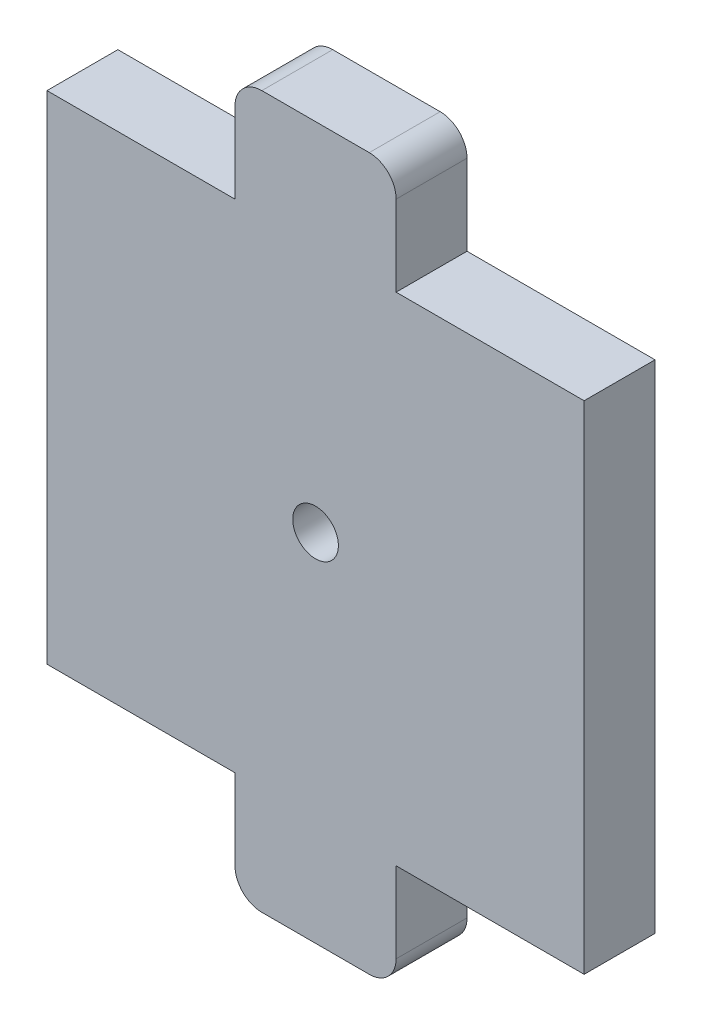
ISO-10303-21;
HEADER;
FILE_DESCRIPTION(('STEP AP214'),'2;1');
FILE_NAME('part.step','',(''),(''),'','','');
FILE_SCHEMA(('AUTOMOTIVE_DESIGN { 1 0 10303 214 1 1 1 1 }'));
ENDSEC;
DATA;
#1=APPLICATION_CONTEXT('core data for automotive mechanical design processes');
#2=APPLICATION_PROTOCOL_DEFINITION('international standard','automotive_design',2000,#1);
#3=PRODUCT_CONTEXT('',#1,'mechanical');
#4=PRODUCT('Part','Part','',(#3));
#5=PRODUCT_RELATED_PRODUCT_CATEGORY('part','',(#4));
#6=PRODUCT_DEFINITION_FORMATION('','',#4);
#7=PRODUCT_DEFINITION_CONTEXT('part definition',#1,'design');
#8=PRODUCT_DEFINITION('design','',#6,#7);
#9=PRODUCT_DEFINITION_SHAPE('','',#8);
#10=(LENGTH_UNIT() NAMED_UNIT(*) SI_UNIT(.MILLI.,.METRE.));
#11=(NAMED_UNIT(*) PLANE_ANGLE_UNIT() SI_UNIT($,.RADIAN.));
#12=(NAMED_UNIT(*) SI_UNIT($,.STERADIAN.) SOLID_ANGLE_UNIT());
#13=UNCERTAINTY_MEASURE_WITH_UNIT(LENGTH_MEASURE(1.E-05),#10,'distance_accuracy_value','');
#14=(GEOMETRIC_REPRESENTATION_CONTEXT(3) GLOBAL_UNCERTAINTY_ASSIGNED_CONTEXT((#13)) GLOBAL_UNIT_ASSIGNED_CONTEXT((#10,
#11,#12)) REPRESENTATION_CONTEXT('',''));
#15=CARTESIAN_POINT('',(0.,0.,0.));
#16=DIRECTION('',(0.,0.,1.));
#17=DIRECTION('',(1.,0.,0.));
#18=AXIS2_PLACEMENT_3D('',#15,#16,#17);
#19=CARTESIAN_POINT('',(-5.,30.62,6.6));
#20=DIRECTION('',(0.,0.,1.));
#21=DIRECTION('',(1.,0.,0.));
#22=AXIS2_PLACEMENT_3D('',#19,#20,#21);
#23=PLANE('',#22);
#24=CARTESIAN_POINT('',(-5.,30.62,6.6));
#25=DIRECTION('',(0.,0.,1.));
#26=DIRECTION('',(1.,0.,0.));
#27=AXIS2_PLACEMENT_3D('',#24,#25,#26);
#28=CIRCLE('',#27,2.5);
#29=CARTESIAN_POINT('',(-5.,33.12,6.6));
#30=VERTEX_POINT('',#29);
#31=CARTESIAN_POINT('',(-7.5,30.62,6.6));
#32=VERTEX_POINT('',#31);
#33=EDGE_CURVE('E209',#30,#32,#28,.T.);
#34=ORIENTED_EDGE('',*,*,#33,.T.);
#35=DIRECTION('',(0.,-1.,0.));
#36=VECTOR('',#35,1.);
#37=CARTESIAN_POINT('',(-7.5,30.62,6.6));
#38=LINE('',#37,#36);
#39=CARTESIAN_POINT('',(-7.5,23.12,6.6));
#40=VERTEX_POINT('',#39);
#41=EDGE_CURVE('E117',#32,#40,#38,.T.);
#42=ORIENTED_EDGE('',*,*,#41,.T.);
#43=DIRECTION('',(-1.,0.,0.));
#44=VECTOR('',#43,1.);
#45=CARTESIAN_POINT('',(-7.5,23.12,6.6));
#46=LINE('',#45,#44);
#47=CARTESIAN_POINT('',(-25.,23.12,6.6));
#48=VERTEX_POINT('',#47);
#49=EDGE_CURVE('E248',#40,#48,#46,.T.);
#50=ORIENTED_EDGE('',*,*,#49,.T.);
#51=DIRECTION('',(0.,-1.,0.));
#52=VECTOR('',#51,1.);
#53=CARTESIAN_POINT('',(-25.,23.12,6.6));
#54=LINE('',#53,#52);
#55=CARTESIAN_POINT('',(-25.,-23.12,6.6));
#56=VERTEX_POINT('',#55);
#57=EDGE_CURVE('E267',#48,#56,#54,.T.);
#58=ORIENTED_EDGE('',*,*,#57,.T.);
#59=DIRECTION('',(1.,0.,0.));
#60=VECTOR('',#59,1.);
#61=CARTESIAN_POINT('',(-25.,-23.12,6.6));
#62=LINE('',#61,#60);
#63=CARTESIAN_POINT('',(-7.5,-23.12,6.6));
#64=VERTEX_POINT('',#63);
#65=EDGE_CURVE('E264',#56,#64,#62,.T.);
#66=ORIENTED_EDGE('',*,*,#65,.T.);
#67=DIRECTION('',(0.,-1.,0.));
#68=VECTOR('',#67,1.);
#69=CARTESIAN_POINT('',(-7.5,-30.62,6.6));
#70=LINE('',#69,#68);
#71=CARTESIAN_POINT('',(-7.5,-30.62,6.6));
#72=VERTEX_POINT('',#71);
#73=EDGE_CURVE('E266',#64,#72,#70,.T.);
#74=ORIENTED_EDGE('',*,*,#73,.T.);
#75=CARTESIAN_POINT('',(-5.,-30.62,6.6));
#76=DIRECTION('',(0.,0.,1.));
#77=DIRECTION('',(1.,0.,0.));
#78=AXIS2_PLACEMENT_3D('',#75,#76,#77);
#79=CIRCLE('',#78,2.5);
#80=CARTESIAN_POINT('',(-5.,-33.12,6.6));
#81=VERTEX_POINT('',#80);
#82=EDGE_CURVE('E269',#72,#81,#79,.T.);
#83=ORIENTED_EDGE('',*,*,#82,.T.);
#84=DIRECTION('',(1.,0.,0.));
#85=VECTOR('',#84,1.);
#86=CARTESIAN_POINT('',(5.,-33.12,6.6));
#87=LINE('',#86,#85);
#88=CARTESIAN_POINT('',(5.,-33.12,6.6));
#89=VERTEX_POINT('',#88);
#90=EDGE_CURVE('E275',#81,#89,#87,.T.);
#91=ORIENTED_EDGE('',*,*,#90,.T.);
#92=CARTESIAN_POINT('',(5.,-30.62,6.6));
#93=DIRECTION('',(0.,0.,1.));
#94=DIRECTION('',(1.,0.,0.));
#95=AXIS2_PLACEMENT_3D('',#92,#93,#94);
#96=CIRCLE('',#95,2.5);
#97=CARTESIAN_POINT('',(7.5,-30.62,6.6));
#98=VERTEX_POINT('',#97);
#99=EDGE_CURVE('E277',#89,#98,#96,.T.);
#100=ORIENTED_EDGE('',*,*,#99,.T.);
#101=DIRECTION('',(0.,1.,0.));
#102=VECTOR('',#101,1.);
#103=CARTESIAN_POINT('',(7.5,-23.12,6.6));
#104=LINE('',#103,#102);
#105=CARTESIAN_POINT('',(7.5,-23.12,6.6));
#106=VERTEX_POINT('',#105);
#107=EDGE_CURVE('E279',#98,#106,#104,.T.);
#108=ORIENTED_EDGE('',*,*,#107,.T.);
#109=DIRECTION('',(1.,0.,0.));
#110=VECTOR('',#109,1.);
#111=CARTESIAN_POINT('',(7.5,-23.12,6.6));
#112=LINE('',#111,#110);
#113=CARTESIAN_POINT('',(25.,-23.12,6.6));
#114=VERTEX_POINT('',#113);
#115=EDGE_CURVE('E281',#106,#114,#112,.T.);
#116=ORIENTED_EDGE('',*,*,#115,.T.);
#117=DIRECTION('',(0.,1.,0.));
#118=VECTOR('',#117,1.);
#119=CARTESIAN_POINT('',(25.,-23.12,6.6));
#120=LINE('',#119,#118);
#121=CARTESIAN_POINT('',(25.,23.12,6.6));
#122=VERTEX_POINT('',#121);
#123=EDGE_CURVE('E283',#114,#122,#120,.T.);
#124=ORIENTED_EDGE('',*,*,#123,.T.);
#125=DIRECTION('',(-1.,0.,0.));
#126=VECTOR('',#125,1.);
#127=CARTESIAN_POINT('',(25.,23.12,6.6));
#128=LINE('',#127,#126);
#129=CARTESIAN_POINT('',(7.5,23.12,6.6));
#130=VERTEX_POINT('',#129);
#131=EDGE_CURVE('E160',#122,#130,#128,.T.);
#132=ORIENTED_EDGE('',*,*,#131,.T.);
#133=DIRECTION('',(0.,1.,0.));
#134=VECTOR('',#133,1.);
#135=CARTESIAN_POINT('',(7.5,23.12,6.6));
#136=LINE('',#135,#134);
#137=CARTESIAN_POINT('',(7.5,30.62,6.6));
#138=VERTEX_POINT('',#137);
#139=EDGE_CURVE('E154',#130,#138,#136,.T.);
#140=ORIENTED_EDGE('',*,*,#139,.T.);
#141=CARTESIAN_POINT('',(5.,30.62,6.6));
#142=DIRECTION('',(0.,0.,1.));
#143=DIRECTION('',(1.,0.,0.));
#144=AXIS2_PLACEMENT_3D('',#141,#142,#143);
#145=CIRCLE('',#144,2.5);
#146=CARTESIAN_POINT('',(5.,33.12,6.6));
#147=VERTEX_POINT('',#146);
#148=EDGE_CURVE('E158',#138,#147,#145,.T.);
#149=ORIENTED_EDGE('',*,*,#148,.T.);
#150=DIRECTION('',(-1.,0.,0.));
#151=VECTOR('',#150,1.);
#152=CARTESIAN_POINT('',(5.,33.12,6.6));
#153=LINE('',#152,#151);
#154=EDGE_CURVE('E50',#147,#30,#153,.T.);
#155=ORIENTED_EDGE('',*,*,#154,.T.);
#156=EDGE_LOOP('',(#34,#42,#50,#58,#66,#74,#83,#91,#100,#108,#116,#124,#132,#140,#149,#155));
#157=FACE_BOUND('',#156,.T.);
#158=CARTESIAN_POINT('',(0.,0.,6.6));
#159=DIRECTION('',(0.,0.,1.));
#160=DIRECTION('',(1.,0.,0.));
#161=AXIS2_PLACEMENT_3D('',#158,#159,#160);
#162=CIRCLE('',#161,2.125);
#163=CARTESIAN_POINT('',(2.125,0.,6.6));
#164=VERTEX_POINT('',#163);
#165=EDGE_CURVE('E182',#164,#164,#162,.T.);
#166=ORIENTED_EDGE('',*,*,#165,.F.);
#167=EDGE_LOOP('',(#166));
#168=FACE_BOUND('',#167,.T.);
#169=ADVANCED_FACE('F33',(#157,#168),#23,.T.);
#170=CARTESIAN_POINT('',(-5.,30.62,0.));
#171=DIRECTION('',(0.,0.,1.));
#172=DIRECTION('',(1.,0.,0.));
#173=AXIS2_PLACEMENT_3D('',#170,#171,#172);
#174=PLANE('',#173);
#175=CARTESIAN_POINT('',(-5.,30.62,0.));
#176=DIRECTION('',(0.,0.,1.));
#177=DIRECTION('',(1.,0.,0.));
#178=AXIS2_PLACEMENT_3D('',#175,#176,#177);
#179=CIRCLE('',#178,2.5);
#180=CARTESIAN_POINT('',(-5.,33.12,0.));
#181=VERTEX_POINT('',#180);
#182=CARTESIAN_POINT('',(-7.5,30.62,0.));
#183=VERTEX_POINT('',#182);
#184=EDGE_CURVE('E178',#181,#183,#179,.T.);
#185=ORIENTED_EDGE('',*,*,#184,.F.);
#186=DIRECTION('',(-1.,0.,0.));
#187=VECTOR('',#186,1.);
#188=CARTESIAN_POINT('',(5.,33.12,0.));
#189=LINE('',#188,#187);
#190=CARTESIAN_POINT('',(5.,33.12,0.));
#191=VERTEX_POINT('',#190);
#192=EDGE_CURVE('E109',#191,#181,#189,.T.);
#193=ORIENTED_EDGE('',*,*,#192,.F.);
#194=CARTESIAN_POINT('',(5.,30.62,0.));
#195=DIRECTION('',(0.,0.,1.));
#196=DIRECTION('',(1.,0.,0.));
#197=AXIS2_PLACEMENT_3D('',#194,#195,#196);
#198=CIRCLE('',#197,2.5);
#199=CARTESIAN_POINT('',(7.5,30.62,0.));
#200=VERTEX_POINT('',#199);
#201=EDGE_CURVE('E103',#200,#191,#198,.T.);
#202=ORIENTED_EDGE('',*,*,#201,.F.);
#203=DIRECTION('',(0.,1.,0.));
#204=VECTOR('',#203,1.);
#205=CARTESIAN_POINT('',(7.5,23.12,0.));
#206=LINE('',#205,#204);
#207=CARTESIAN_POINT('',(7.5,23.12,0.));
#208=VERTEX_POINT('',#207);
#209=EDGE_CURVE('E168',#208,#200,#206,.T.);
#210=ORIENTED_EDGE('',*,*,#209,.F.);
#211=DIRECTION('',(-1.,0.,0.));
#212=VECTOR('',#211,1.);
#213=CARTESIAN_POINT('',(25.,23.12,0.));
#214=LINE('',#213,#212);
#215=CARTESIAN_POINT('',(25.,23.12,0.));
#216=VERTEX_POINT('',#215);
#217=EDGE_CURVE('E204',#216,#208,#214,.T.);
#218=ORIENTED_EDGE('',*,*,#217,.F.);
#219=DIRECTION('',(0.,1.,0.));
#220=VECTOR('',#219,1.);
#221=CARTESIAN_POINT('',(25.,-23.12,0.));
#222=LINE('',#221,#220);
#223=CARTESIAN_POINT('',(25.,-23.12,0.));
#224=VERTEX_POINT('',#223);
#225=EDGE_CURVE('E202',#224,#216,#222,.T.);
#226=ORIENTED_EDGE('',*,*,#225,.F.);
#227=DIRECTION('',(1.,0.,0.));
#228=VECTOR('',#227,1.);
#229=CARTESIAN_POINT('',(7.5,-23.12,0.));
#230=LINE('',#229,#228);
#231=CARTESIAN_POINT('',(7.5,-23.12,0.));
#232=VERTEX_POINT('',#231);
#233=EDGE_CURVE('E200',#232,#224,#230,.T.);
#234=ORIENTED_EDGE('',*,*,#233,.F.);
#235=DIRECTION('',(0.,1.,0.));
#236=VECTOR('',#235,1.);
#237=CARTESIAN_POINT('',(7.5,-23.12,0.));
#238=LINE('',#237,#236);
#239=CARTESIAN_POINT('',(7.5,-30.62,0.));
#240=VERTEX_POINT('',#239);
#241=EDGE_CURVE('E198',#240,#232,#238,.T.);
#242=ORIENTED_EDGE('',*,*,#241,.F.);
#243=CARTESIAN_POINT('',(5.,-30.62,0.));
#244=DIRECTION('',(0.,0.,1.));
#245=DIRECTION('',(1.,0.,0.));
#246=AXIS2_PLACEMENT_3D('',#243,#244,#245);
#247=CIRCLE('',#246,2.5);
#248=CARTESIAN_POINT('',(5.,-33.12,0.));
#249=VERTEX_POINT('',#248);
#250=EDGE_CURVE('E196',#249,#240,#247,.T.);
#251=ORIENTED_EDGE('',*,*,#250,.F.);
#252=DIRECTION('',(1.,0.,0.));
#253=VECTOR('',#252,1.);
#254=CARTESIAN_POINT('',(5.,-33.12,0.));
#255=LINE('',#254,#253);
#256=CARTESIAN_POINT('',(-5.,-33.12,0.));
#257=VERTEX_POINT('',#256);
#258=EDGE_CURVE('E194',#257,#249,#255,.T.);
#259=ORIENTED_EDGE('',*,*,#258,.F.);
#260=CARTESIAN_POINT('',(-5.,-30.62,0.));
#261=DIRECTION('',(0.,0.,1.));
#262=DIRECTION('',(1.,0.,0.));
#263=AXIS2_PLACEMENT_3D('',#260,#261,#262);
#264=CIRCLE('',#263,2.5);
#265=CARTESIAN_POINT('',(-7.5,-30.62,0.));
#266=VERTEX_POINT('',#265);
#267=EDGE_CURVE('E192',#266,#257,#264,.T.);
#268=ORIENTED_EDGE('',*,*,#267,.F.);
#269=DIRECTION('',(0.,-1.,0.));
#270=VECTOR('',#269,1.);
#271=CARTESIAN_POINT('',(-7.5,-30.62,0.));
#272=LINE('',#271,#270);
#273=CARTESIAN_POINT('',(-7.5,-23.12,0.));
#274=VERTEX_POINT('',#273);
#275=EDGE_CURVE('E190',#274,#266,#272,.T.);
#276=ORIENTED_EDGE('',*,*,#275,.F.);
#277=DIRECTION('',(1.,0.,0.));
#278=VECTOR('',#277,1.);
#279=CARTESIAN_POINT('',(-25.,-23.12,0.));
#280=LINE('',#279,#278);
#281=CARTESIAN_POINT('',(-25.,-23.12,0.));
#282=VERTEX_POINT('',#281);
#283=EDGE_CURVE('E188',#282,#274,#280,.T.);
#284=ORIENTED_EDGE('',*,*,#283,.F.);
#285=DIRECTION('',(0.,-1.,0.));
#286=VECTOR('',#285,1.);
#287=CARTESIAN_POINT('',(-25.,23.12,0.));
#288=LINE('',#287,#286);
#289=CARTESIAN_POINT('',(-25.,23.12,0.));
#290=VERTEX_POINT('',#289);
#291=EDGE_CURVE('E186',#290,#282,#288,.T.);
#292=ORIENTED_EDGE('',*,*,#291,.F.);
#293=DIRECTION('',(-1.,0.,0.));
#294=VECTOR('',#293,1.);
#295=CARTESIAN_POINT('',(-7.5,23.12,0.));
#296=LINE('',#295,#294);
#297=CARTESIAN_POINT('',(-7.5,23.12,0.));
#298=VERTEX_POINT('',#297);
#299=EDGE_CURVE('E184',#298,#290,#296,.T.);
#300=ORIENTED_EDGE('',*,*,#299,.F.);
#301=DIRECTION('',(0.,-1.,0.));
#302=VECTOR('',#301,1.);
#303=CARTESIAN_POINT('',(-7.5,30.62,0.));
#304=LINE('',#303,#302);
#305=EDGE_CURVE('E181',#183,#298,#304,.T.);
#306=ORIENTED_EDGE('',*,*,#305,.F.);
#307=EDGE_LOOP('',(#185,#193,#202,#210,#218,#226,#234,#242,#251,#259,#268,#276,#284,#292,#300,#306));
#308=FACE_BOUND('',#307,.T.);
#309=CARTESIAN_POINT('',(0.,0.,0.));
#310=DIRECTION('',(0.,0.,1.));
#311=DIRECTION('',(1.,0.,0.));
#312=AXIS2_PLACEMENT_3D('',#309,#310,#311);
#313=CIRCLE('',#312,2.125);
#314=CARTESIAN_POINT('',(2.125,0.,0.));
#315=VERTEX_POINT('',#314);
#316=EDGE_CURVE('E482',#315,#315,#313,.T.);
#317=ORIENTED_EDGE('',*,*,#316,.T.);
#318=EDGE_LOOP('',(#317));
#319=FACE_BOUND('',#318,.T.);
#320=ADVANCED_FACE('F252',(#308,#319),#174,.F.);
#321=CARTESIAN_POINT('',(-5.,30.62,6.6));
#322=DIRECTION('',(0.,0.,-1.));
#323=DIRECTION('',(-1.,0.,0.));
#324=AXIS2_PLACEMENT_3D('',#321,#322,#323);
#325=CYLINDRICAL_SURFACE('',#324,2.5);
#326=ORIENTED_EDGE('',*,*,#184,.T.);
#327=DIRECTION('',(0.,0.,-1.));
#328=VECTOR('',#327,1.);
#329=CARTESIAN_POINT('',(-7.5,30.62,6.6));
#330=LINE('',#329,#328);
#331=EDGE_CURVE('E11',#32,#183,#330,.T.);
#332=ORIENTED_EDGE('',*,*,#331,.F.);
#333=ORIENTED_EDGE('',*,*,#33,.F.);
#334=DIRECTION('',(0.,0.,-1.));
#335=VECTOR('',#334,1.);
#336=CARTESIAN_POINT('',(-5.,33.12,6.6));
#337=LINE('',#336,#335);
#338=EDGE_CURVE('E174',#30,#181,#337,.T.);
#339=ORIENTED_EDGE('',*,*,#338,.T.);
#340=EDGE_LOOP('',(#326,#332,#333,#339));
#341=FACE_BOUND('',#340,.T.);
#342=ADVANCED_FACE('F35',(#341),#325,.T.);
#343=CARTESIAN_POINT('',(-7.5,30.62,6.6));
#344=DIRECTION('',(1.,0.,0.));
#345=DIRECTION('',(0.,0.,-1.));
#346=AXIS2_PLACEMENT_3D('',#343,#344,#345);
#347=PLANE('',#346);
#348=ORIENTED_EDGE('',*,*,#305,.T.);
#349=DIRECTION('',(0.,0.,-1.));
#350=VECTOR('',#349,1.);
#351=CARTESIAN_POINT('',(-7.5,23.12,6.6));
#352=LINE('',#351,#350);
#353=EDGE_CURVE('E42',#40,#298,#352,.T.);
#354=ORIENTED_EDGE('',*,*,#353,.F.);
#355=ORIENTED_EDGE('',*,*,#41,.F.);
#356=ORIENTED_EDGE('',*,*,#331,.T.);
#357=EDGE_LOOP('',(#348,#354,#355,#356));
#358=FACE_BOUND('',#357,.T.);
#359=ADVANCED_FACE('F317',(#358),#347,.F.);
#360=CARTESIAN_POINT('',(-7.5,23.12,6.6));
#361=DIRECTION('',(0.,-1.,0.));
#362=DIRECTION('',(0.,0.,-1.));
#363=AXIS2_PLACEMENT_3D('',#360,#361,#362);
#364=PLANE('',#363);
#365=ORIENTED_EDGE('',*,*,#299,.T.);
#366=DIRECTION('',(0.,0.,-1.));
#367=VECTOR('',#366,1.);
#368=CARTESIAN_POINT('',(-25.,23.12,6.6));
#369=LINE('',#368,#367);
#370=EDGE_CURVE('E240',#48,#290,#369,.T.);
#371=ORIENTED_EDGE('',*,*,#370,.F.);
#372=ORIENTED_EDGE('',*,*,#49,.F.);
#373=ORIENTED_EDGE('',*,*,#353,.T.);
#374=EDGE_LOOP('',(#365,#371,#372,#373));
#375=FACE_BOUND('',#374,.T.);
#376=ADVANCED_FACE('F246',(#375),#364,.F.);
#377=CARTESIAN_POINT('',(-25.,23.12,6.6));
#378=DIRECTION('',(1.,0.,0.));
#379=DIRECTION('',(0.,0.,-1.));
#380=AXIS2_PLACEMENT_3D('',#377,#378,#379);
#381=PLANE('',#380);
#382=ORIENTED_EDGE('',*,*,#291,.T.);
#383=DIRECTION('',(0.,0.,-1.));
#384=VECTOR('',#383,1.);
#385=CARTESIAN_POINT('',(-25.,-23.12,6.6));
#386=LINE('',#385,#384);
#387=EDGE_CURVE('E237',#56,#282,#386,.T.);
#388=ORIENTED_EDGE('',*,*,#387,.F.);
#389=ORIENTED_EDGE('',*,*,#57,.F.);
#390=ORIENTED_EDGE('',*,*,#370,.T.);
#391=EDGE_LOOP('',(#382,#388,#389,#390));
#392=FACE_BOUND('',#391,.T.);
#393=ADVANCED_FACE('F258',(#392),#381,.F.);
#394=CARTESIAN_POINT('',(-25.,-23.12,6.6));
#395=DIRECTION('',(0.,1.,0.));
#396=DIRECTION('',(0.,0.,1.));
#397=AXIS2_PLACEMENT_3D('',#394,#395,#396);
#398=PLANE('',#397);
#399=ORIENTED_EDGE('',*,*,#283,.T.);
#400=DIRECTION('',(0.,0.,-1.));
#401=VECTOR('',#400,1.);
#402=CARTESIAN_POINT('',(-7.5,-23.12,6.6));
#403=LINE('',#402,#401);
#404=EDGE_CURVE('E234',#64,#274,#403,.T.);
#405=ORIENTED_EDGE('',*,*,#404,.F.);
#406=ORIENTED_EDGE('',*,*,#65,.F.);
#407=ORIENTED_EDGE('',*,*,#387,.T.);
#408=EDGE_LOOP('',(#399,#405,#406,#407));
#409=FACE_BOUND('',#408,.T.);
#410=ADVANCED_FACE('F262',(#409),#398,.F.);
#411=CARTESIAN_POINT('',(-7.5,-30.62,6.6));
#412=DIRECTION('',(1.,0.,0.));
#413=DIRECTION('',(0.,0.,-1.));
#414=AXIS2_PLACEMENT_3D('',#411,#412,#413);
#415=PLANE('',#414);
#416=ORIENTED_EDGE('',*,*,#275,.T.);
#417=DIRECTION('',(0.,0.,-1.));
#418=VECTOR('',#417,1.);
#419=CARTESIAN_POINT('',(-7.5,-30.62,6.6));
#420=LINE('',#419,#418);
#421=EDGE_CURVE('E231',#72,#266,#420,.T.);
#422=ORIENTED_EDGE('',*,*,#421,.F.);
#423=ORIENTED_EDGE('',*,*,#73,.F.);
#424=ORIENTED_EDGE('',*,*,#404,.T.);
#425=EDGE_LOOP('',(#416,#422,#423,#424));
#426=FACE_BOUND('',#425,.T.);
#427=ADVANCED_FACE('F330',(#426),#415,.F.);
#428=CARTESIAN_POINT('',(-5.,-30.62,6.6));
#429=DIRECTION('',(0.,0.,-1.));
#430=DIRECTION('',(-1.,0.,0.));
#431=AXIS2_PLACEMENT_3D('',#428,#429,#430);
#432=CYLINDRICAL_SURFACE('',#431,2.5);
#433=ORIENTED_EDGE('',*,*,#267,.T.);
#434=DIRECTION('',(0.,0.,-1.));
#435=VECTOR('',#434,1.);
#436=CARTESIAN_POINT('',(-5.,-33.12,6.6));
#437=LINE('',#436,#435);
#438=EDGE_CURVE('E228',#81,#257,#437,.T.);
#439=ORIENTED_EDGE('',*,*,#438,.F.);
#440=ORIENTED_EDGE('',*,*,#82,.F.);
#441=ORIENTED_EDGE('',*,*,#421,.T.);
#442=EDGE_LOOP('',(#433,#439,#440,#441));
#443=FACE_BOUND('',#442,.T.);
#444=ADVANCED_FACE('F333',(#443),#432,.T.);
#445=CARTESIAN_POINT('',(5.,-33.12,6.6));
#446=DIRECTION('',(0.,1.,0.));
#447=DIRECTION('',(0.,0.,1.));
#448=AXIS2_PLACEMENT_3D('',#445,#446,#447);
#449=PLANE('',#448);
#450=ORIENTED_EDGE('',*,*,#258,.T.);
#451=DIRECTION('',(0.,0.,-1.));
#452=VECTOR('',#451,1.);
#453=CARTESIAN_POINT('',(5.,-33.12,6.6));
#454=LINE('',#453,#452);
#455=EDGE_CURVE('E225',#89,#249,#454,.T.);
#456=ORIENTED_EDGE('',*,*,#455,.F.);
#457=ORIENTED_EDGE('',*,*,#90,.F.);
#458=ORIENTED_EDGE('',*,*,#438,.T.);
#459=EDGE_LOOP('',(#450,#456,#457,#458));
#460=FACE_BOUND('',#459,.T.);
#461=ADVANCED_FACE('F337',(#460),#449,.F.);
#462=CARTESIAN_POINT('',(5.,-30.62,6.6));
#463=DIRECTION('',(0.,0.,-1.));
#464=DIRECTION('',(-1.,0.,0.));
#465=AXIS2_PLACEMENT_3D('',#462,#463,#464);
#466=CYLINDRICAL_SURFACE('',#465,2.5);
#467=ORIENTED_EDGE('',*,*,#250,.T.);
#468=DIRECTION('',(0.,0.,-1.));
#469=VECTOR('',#468,1.);
#470=CARTESIAN_POINT('',(7.5,-30.62,6.6));
#471=LINE('',#470,#469);
#472=EDGE_CURVE('E222',#98,#240,#471,.T.);
#473=ORIENTED_EDGE('',*,*,#472,.F.);
#474=ORIENTED_EDGE('',*,*,#99,.F.);
#475=ORIENTED_EDGE('',*,*,#455,.T.);
#476=EDGE_LOOP('',(#467,#473,#474,#475));
#477=FACE_BOUND('',#476,.T.);
#478=ADVANCED_FACE('F341',(#477),#466,.T.);
#479=CARTESIAN_POINT('',(7.5,-23.12,6.6));
#480=DIRECTION('',(-1.,0.,0.));
#481=DIRECTION('',(0.,0.,1.));
#482=AXIS2_PLACEMENT_3D('',#479,#480,#481);
#483=PLANE('',#482);
#484=ORIENTED_EDGE('',*,*,#241,.T.);
#485=DIRECTION('',(0.,0.,-1.));
#486=VECTOR('',#485,1.);
#487=CARTESIAN_POINT('',(7.5,-23.12,6.6));
#488=LINE('',#487,#486);
#489=EDGE_CURVE('E219',#106,#232,#488,.T.);
#490=ORIENTED_EDGE('',*,*,#489,.F.);
#491=ORIENTED_EDGE('',*,*,#107,.F.);
#492=ORIENTED_EDGE('',*,*,#472,.T.);
#493=EDGE_LOOP('',(#484,#490,#491,#492));
#494=FACE_BOUND('',#493,.T.);
#495=ADVANCED_FACE('F345',(#494),#483,.F.);
#496=CARTESIAN_POINT('',(7.5,-23.12,6.6));
#497=DIRECTION('',(0.,1.,0.));
#498=DIRECTION('',(0.,0.,1.));
#499=AXIS2_PLACEMENT_3D('',#496,#497,#498);
#500=PLANE('',#499);
#501=ORIENTED_EDGE('',*,*,#233,.T.);
#502=DIRECTION('',(0.,0.,-1.));
#503=VECTOR('',#502,1.);
#504=CARTESIAN_POINT('',(25.,-23.12,6.6));
#505=LINE('',#504,#503);
#506=EDGE_CURVE('E216',#114,#224,#505,.T.);
#507=ORIENTED_EDGE('',*,*,#506,.F.);
#508=ORIENTED_EDGE('',*,*,#115,.F.);
#509=ORIENTED_EDGE('',*,*,#489,.T.);
#510=EDGE_LOOP('',(#501,#507,#508,#509));
#511=FACE_BOUND('',#510,.T.);
#512=ADVANCED_FACE('F349',(#511),#500,.F.);
#513=CARTESIAN_POINT('',(25.,-23.12,6.6));
#514=DIRECTION('',(-1.,0.,0.));
#515=DIRECTION('',(0.,0.,1.));
#516=AXIS2_PLACEMENT_3D('',#513,#514,#515);
#517=PLANE('',#516);
#518=ORIENTED_EDGE('',*,*,#225,.T.);
#519=DIRECTION('',(0.,0.,-1.));
#520=VECTOR('',#519,1.);
#521=CARTESIAN_POINT('',(25.,23.12,6.6));
#522=LINE('',#521,#520);
#523=EDGE_CURVE('E213',#122,#216,#522,.T.);
#524=ORIENTED_EDGE('',*,*,#523,.F.);
#525=ORIENTED_EDGE('',*,*,#123,.F.);
#526=ORIENTED_EDGE('',*,*,#506,.T.);
#527=EDGE_LOOP('',(#518,#524,#525,#526));
#528=FACE_BOUND('',#527,.T.);
#529=ADVANCED_FACE('F289',(#528),#517,.F.);
#530=CARTESIAN_POINT('',(25.,23.12,6.6));
#531=DIRECTION('',(0.,-1.,0.));
#532=DIRECTION('',(0.,0.,-1.));
#533=AXIS2_PLACEMENT_3D('',#530,#531,#532);
#534=PLANE('',#533);
#535=ORIENTED_EDGE('',*,*,#217,.T.);
#536=DIRECTION('',(0.,0.,-1.));
#537=VECTOR('',#536,1.);
#538=CARTESIAN_POINT('',(7.5,23.12,6.6));
#539=LINE('',#538,#537);
#540=EDGE_CURVE('E169',#130,#208,#539,.T.);
#541=ORIENTED_EDGE('',*,*,#540,.F.);
#542=ORIENTED_EDGE('',*,*,#131,.F.);
#543=ORIENTED_EDGE('',*,*,#523,.T.);
#544=EDGE_LOOP('',(#535,#541,#542,#543));
#545=FACE_BOUND('',#544,.T.);
#546=ADVANCED_FACE('F293',(#545),#534,.F.);
#547=CARTESIAN_POINT('',(7.5,23.12,6.6));
#548=DIRECTION('',(-1.,0.,0.));
#549=DIRECTION('',(0.,0.,1.));
#550=AXIS2_PLACEMENT_3D('',#547,#548,#549);
#551=PLANE('',#550);
#552=ORIENTED_EDGE('',*,*,#209,.T.);
#553=DIRECTION('',(0.,0.,-1.));
#554=VECTOR('',#553,1.);
#555=CARTESIAN_POINT('',(7.5,30.62,6.6));
#556=LINE('',#555,#554);
#557=EDGE_CURVE('E165',#138,#200,#556,.T.);
#558=ORIENTED_EDGE('',*,*,#557,.F.);
#559=ORIENTED_EDGE('',*,*,#139,.F.);
#560=ORIENTED_EDGE('',*,*,#540,.T.);
#561=EDGE_LOOP('',(#552,#558,#559,#560));
#562=FACE_BOUND('',#561,.T.);
#563=ADVANCED_FACE('F166',(#562),#551,.F.);
#564=CARTESIAN_POINT('',(5.,30.62,6.6));
#565=DIRECTION('',(0.,0.,-1.));
#566=DIRECTION('',(-1.,0.,0.));
#567=AXIS2_PLACEMENT_3D('',#564,#565,#566);
#568=CYLINDRICAL_SURFACE('',#567,2.5);
#569=ORIENTED_EDGE('',*,*,#201,.T.);
#570=DIRECTION('',(0.,0.,-1.));
#571=VECTOR('',#570,1.);
#572=CARTESIAN_POINT('',(5.,33.12,6.6));
#573=LINE('',#572,#571);
#574=EDGE_CURVE('E170',#147,#191,#573,.T.);
#575=ORIENTED_EDGE('',*,*,#574,.F.);
#576=ORIENTED_EDGE('',*,*,#148,.F.);
#577=ORIENTED_EDGE('',*,*,#557,.T.);
#578=EDGE_LOOP('',(#569,#575,#576,#577));
#579=FACE_BOUND('',#578,.T.);
#580=ADVANCED_FACE('F172',(#579),#568,.T.);
#581=CARTESIAN_POINT('',(5.,33.12,6.6));
#582=DIRECTION('',(0.,-1.,0.));
#583=DIRECTION('',(0.,0.,-1.));
#584=AXIS2_PLACEMENT_3D('',#581,#582,#583);
#585=PLANE('',#584);
#586=ORIENTED_EDGE('',*,*,#192,.T.);
#587=ORIENTED_EDGE('',*,*,#338,.F.);
#588=ORIENTED_EDGE('',*,*,#154,.F.);
#589=ORIENTED_EDGE('',*,*,#574,.T.);
#590=EDGE_LOOP('',(#586,#587,#588,#589));
#591=FACE_BOUND('',#590,.T.);
#592=ADVANCED_FACE('F297',(#591),#585,.F.);
#593=CARTESIAN_POINT('',(0.,0.,6.6));
#594=DIRECTION('',(0.,0.,-1.));
#595=DIRECTION('',(-1.,0.,0.));
#596=AXIS2_PLACEMENT_3D('',#593,#594,#595);
#597=CYLINDRICAL_SURFACE('',#596,2.125);
#598=ORIENTED_EDGE('',*,*,#165,.T.);
#599=EDGE_LOOP('',(#598));
#600=FACE_BOUND('',#599,.T.);
#601=ORIENTED_EDGE('',*,*,#316,.F.);
#602=EDGE_LOOP('',(#601));
#603=FACE_BOUND('',#602,.T.);
#604=ADVANCED_FACE('F299',(#600,#603),#597,.F.);
#605=CLOSED_SHELL('',(#169,#320,#342,#359,#376,#393,#410,#427,#444,#461,#478,#495,#512,#529,
#546,#563,#580,#592,#604));
#606=MANIFOLD_SOLID_BREP('B2',#605);
#607=ADVANCED_BREP_SHAPE_REPRESENTATION('',(#18,#606),#14);
#608=SHAPE_DEFINITION_REPRESENTATION(#9,#607);
ENDSEC;
END-ISO-10303-21;
